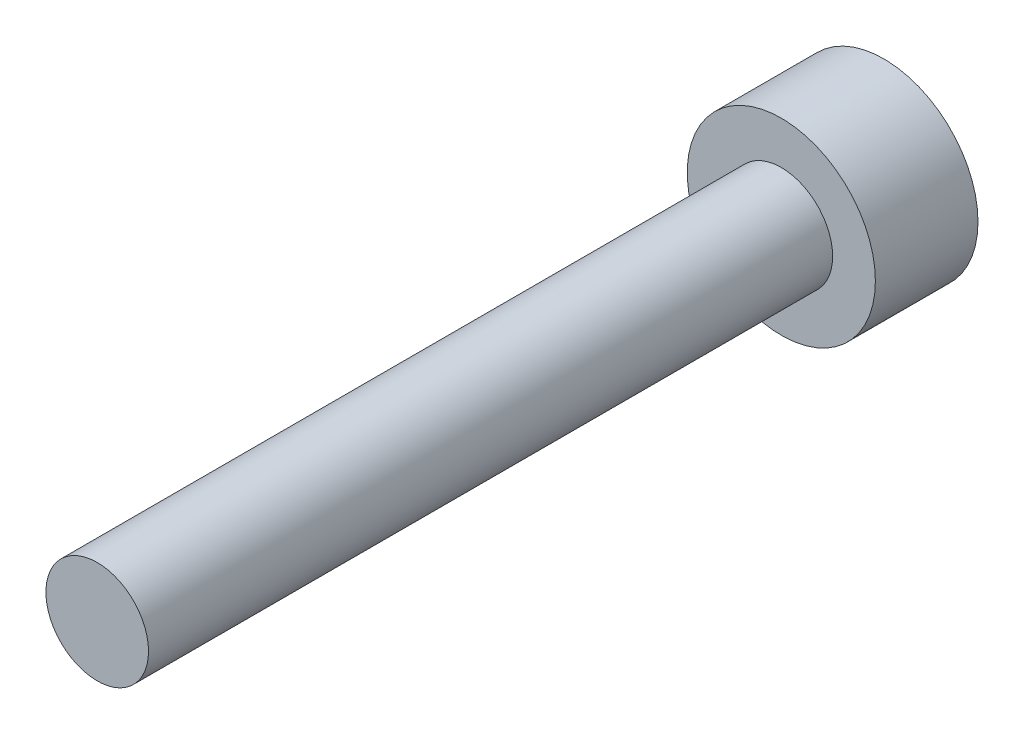
ISO-10303-21;
HEADER;
FILE_DESCRIPTION(('STEP AP214'),'2;1');
FILE_NAME('part.step','',(''),(''),'','','');
FILE_SCHEMA(('AUTOMOTIVE_DESIGN { 1 0 10303 214 1 1 1 1 }'));
ENDSEC;
DATA;
#1=APPLICATION_CONTEXT('core data for automotive mechanical design processes');
#2=APPLICATION_PROTOCOL_DEFINITION('international standard','automotive_design',2000,#1);
#3=PRODUCT_CONTEXT('',#1,'mechanical');
#4=PRODUCT('Part','Part','',(#3));
#5=PRODUCT_RELATED_PRODUCT_CATEGORY('part','',(#4));
#6=PRODUCT_DEFINITION_FORMATION('','',#4);
#7=PRODUCT_DEFINITION_CONTEXT('part definition',#1,'design');
#8=PRODUCT_DEFINITION('design','',#6,#7);
#9=PRODUCT_DEFINITION_SHAPE('','',#8);
#10=(LENGTH_UNIT() NAMED_UNIT(*) SI_UNIT(.MILLI.,.METRE.));
#11=(NAMED_UNIT(*) PLANE_ANGLE_UNIT() SI_UNIT($,.RADIAN.));
#12=(NAMED_UNIT(*) SI_UNIT($,.STERADIAN.) SOLID_ANGLE_UNIT());
#13=UNCERTAINTY_MEASURE_WITH_UNIT(LENGTH_MEASURE(1.E-05),#10,'distance_accuracy_value','');
#14=(GEOMETRIC_REPRESENTATION_CONTEXT(3) GLOBAL_UNCERTAINTY_ASSIGNED_CONTEXT((#13)) GLOBAL_UNIT_ASSIGNED_CONTEXT((#10,
#11,#12)) REPRESENTATION_CONTEXT('',''));
#15=CARTESIAN_POINT('',(0.,0.,0.));
#16=DIRECTION('',(0.,0.,1.));
#17=DIRECTION('',(1.,0.,0.));
#18=AXIS2_PLACEMENT_3D('',#15,#16,#17);
#19=CARTESIAN_POINT('',(0.,0.,3.));
#20=DIRECTION('',(0.,0.,-1.));
#21=DIRECTION('',(-1.,0.,0.));
#22=AXIS2_PLACEMENT_3D('',#19,#20,#21);
#23=CYLINDRICAL_SURFACE('',#22,2.75);
#24=CARTESIAN_POINT('',(0.,0.,3.));
#25=DIRECTION('',(0.,0.,1.));
#26=DIRECTION('',(1.,0.,0.));
#27=AXIS2_PLACEMENT_3D('',#24,#25,#26);
#28=CIRCLE('',#27,2.75);
#29=CARTESIAN_POINT('',(2.75,0.,3.));
#30=VERTEX_POINT('',#29);
#31=EDGE_CURVE('E44',#30,#30,#28,.T.);
#32=ORIENTED_EDGE('',*,*,#31,.F.);
#33=EDGE_LOOP('',(#32));
#34=FACE_BOUND('',#33,.T.);
#35=CARTESIAN_POINT('',(0.,0.,0.));
#36=DIRECTION('',(0.,0.,1.));
#37=DIRECTION('',(1.,0.,0.));
#38=AXIS2_PLACEMENT_3D('',#35,#36,#37);
#39=CIRCLE('',#38,2.75);
#40=CARTESIAN_POINT('',(2.75,0.,0.));
#41=VERTEX_POINT('',#40);
#42=EDGE_CURVE('E40',#41,#41,#39,.T.);
#43=ORIENTED_EDGE('',*,*,#42,.T.);
#44=EDGE_LOOP('',(#43));
#45=FACE_BOUND('',#44,.T.);
#46=ADVANCED_FACE('F37',(#34,#45),#23,.T.);
#47=CARTESIAN_POINT('',(0.,0.,3.));
#48=DIRECTION('',(0.,0.,1.));
#49=DIRECTION('',(1.,0.,0.));
#50=AXIS2_PLACEMENT_3D('',#47,#48,#49);
#51=PLANE('',#50);
#52=CARTESIAN_POINT('',(0.,0.,3.));
#53=DIRECTION('',(0.,0.,1.));
#54=DIRECTION('',(1.,0.,0.));
#55=AXIS2_PLACEMENT_3D('',#52,#53,#54);
#56=CIRCLE('',#55,1.5);
#57=CARTESIAN_POINT('',(1.5,0.,3.));
#58=VERTEX_POINT('',#57);
#59=EDGE_CURVE('E10',#58,#58,#56,.T.);
#60=ORIENTED_EDGE('',*,*,#59,.F.);
#61=EDGE_LOOP('',(#60));
#62=FACE_BOUND('',#61,.T.);
#63=ORIENTED_EDGE('',*,*,#31,.T.);
#64=EDGE_LOOP('',(#63));
#65=FACE_BOUND('',#64,.T.);
#66=ADVANCED_FACE('F61',(#62,#65),#51,.T.);
#67=CARTESIAN_POINT('',(0.,0.,0.));
#68=DIRECTION('',(0.,0.,1.));
#69=DIRECTION('',(1.,0.,0.));
#70=AXIS2_PLACEMENT_3D('',#67,#68,#69);
#71=PLANE('',#70);
#72=ORIENTED_EDGE('',*,*,#42,.F.);
#73=EDGE_LOOP('',(#72));
#74=FACE_BOUND('',#73,.T.);
#75=ADVANCED_FACE('F58',(#74),#71,.F.);
#76=CARTESIAN_POINT('',(0.,0.,23.));
#77=DIRECTION('',(0.,0.,-1.));
#78=DIRECTION('',(-1.,0.,0.));
#79=AXIS2_PLACEMENT_3D('',#76,#77,#78);
#80=CYLINDRICAL_SURFACE('',#79,1.5);
#81=CARTESIAN_POINT('',(0.,0.,23.));
#82=DIRECTION('',(0.,0.,1.));
#83=DIRECTION('',(1.,0.,0.));
#84=AXIS2_PLACEMENT_3D('',#81,#82,#83);
#85=CIRCLE('',#84,1.5);
#86=CARTESIAN_POINT('',(1.5,0.,23.));
#87=VERTEX_POINT('',#86);
#88=EDGE_CURVE('E50',#87,#87,#85,.T.);
#89=ORIENTED_EDGE('',*,*,#88,.F.);
#90=EDGE_LOOP('',(#89));
#91=FACE_BOUND('',#90,.T.);
#92=ORIENTED_EDGE('',*,*,#59,.T.);
#93=EDGE_LOOP('',(#92));
#94=FACE_BOUND('',#93,.T.);
#95=ADVANCED_FACE('F60',(#91,#94),#80,.T.);
#96=CARTESIAN_POINT('',(0.,0.,23.));
#97=DIRECTION('',(0.,0.,1.));
#98=DIRECTION('',(1.,0.,0.));
#99=AXIS2_PLACEMENT_3D('',#96,#97,#98);
#100=PLANE('',#99);
#101=ORIENTED_EDGE('',*,*,#88,.T.);
#102=EDGE_LOOP('',(#101));
#103=FACE_BOUND('',#102,.T.);
#104=ADVANCED_FACE('F66',(#103),#100,.T.);
#105=CLOSED_SHELL('',(#46,#66,#75,#95,#104));
#106=MANIFOLD_SOLID_BREP('B2',#105);
#107=ADVANCED_BREP_SHAPE_REPRESENTATION('',(#18,#106),#14);
#108=SHAPE_DEFINITION_REPRESENTATION(#9,#107);
ENDSEC;
END-ISO-10303-21;
